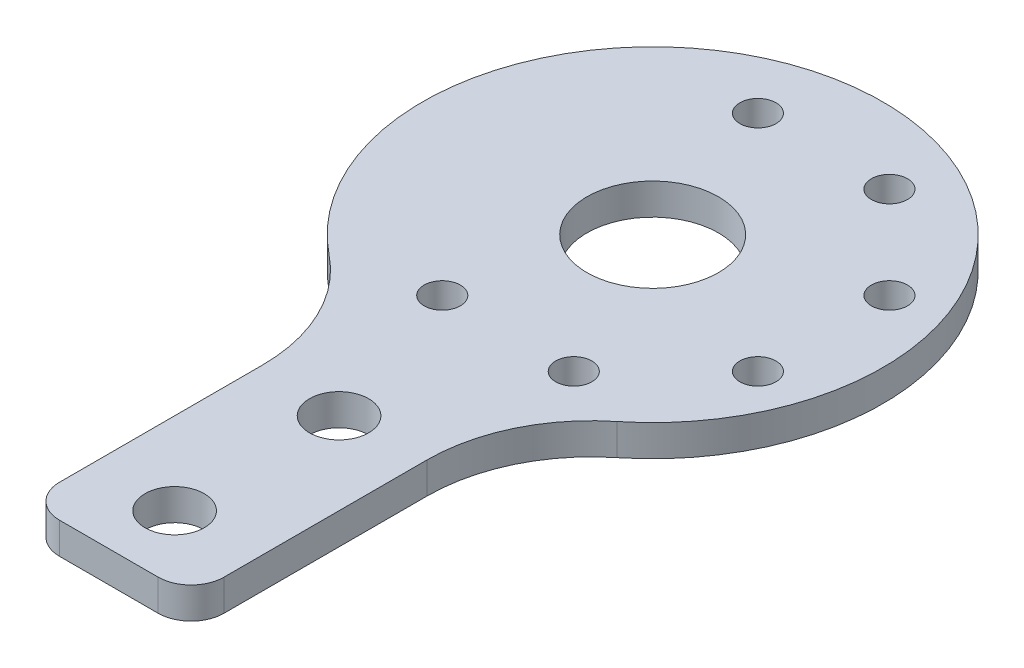
ISO-10303-21;
HEADER;
FILE_DESCRIPTION(('STEP AP214'),'2;1');
FILE_NAME('part.step','',(''),(''),'','','');
FILE_SCHEMA(('AUTOMOTIVE_DESIGN { 1 0 10303 214 1 1 1 1 }'));
ENDSEC;
DATA;
#1=APPLICATION_CONTEXT('core data for automotive mechanical design processes');
#2=APPLICATION_PROTOCOL_DEFINITION('international standard','automotive_design',2000,#1);
#3=PRODUCT_CONTEXT('',#1,'mechanical');
#4=PRODUCT('Part','Part','',(#3));
#5=PRODUCT_RELATED_PRODUCT_CATEGORY('part','',(#4));
#6=PRODUCT_DEFINITION_FORMATION('','',#4);
#7=PRODUCT_DEFINITION_CONTEXT('part definition',#1,'design');
#8=PRODUCT_DEFINITION('design','',#6,#7);
#9=PRODUCT_DEFINITION_SHAPE('','',#8);
#10=(LENGTH_UNIT() NAMED_UNIT(*) SI_UNIT(.MILLI.,.METRE.));
#11=(NAMED_UNIT(*) PLANE_ANGLE_UNIT() SI_UNIT($,.RADIAN.));
#12=(NAMED_UNIT(*) SI_UNIT($,.STERADIAN.) SOLID_ANGLE_UNIT());
#13=UNCERTAINTY_MEASURE_WITH_UNIT(LENGTH_MEASURE(1.E-05),#10,'distance_accuracy_value','');
#14=(GEOMETRIC_REPRESENTATION_CONTEXT(3) GLOBAL_UNCERTAINTY_ASSIGNED_CONTEXT((#13)) GLOBAL_UNIT_ASSIGNED_CONTEXT((#10,
#11,#12)) REPRESENTATION_CONTEXT('',''));
#15=CARTESIAN_POINT('',(0.,0.,0.));
#16=DIRECTION('',(0.,0.,1.));
#17=DIRECTION('',(1.,0.,0.));
#18=AXIS2_PLACEMENT_3D('',#15,#16,#17);
#19=CARTESIAN_POINT('',(12.5,4.7625,82.6917420765551));
#20=DIRECTION('',(-1.,0.,0.));
#21=DIRECTION('',(0.,0.,1.));
#22=AXIS2_PLACEMENT_3D('',#19,#20,#21);
#23=PLANE('',#22);
#24=DIRECTION('',(0.,0.,-1.));
#25=VECTOR('',#24,1.);
#26=CARTESIAN_POINT('',(12.5,4.7625,82.6917420765551));
#27=LINE('',#26,#25);
#28=CARTESIAN_POINT('',(12.5,4.7625,77.691742076555));
#29=VERTEX_POINT('',#28);
#30=CARTESIAN_POINT('',(12.5,4.7625,46.837484987988));
#31=VERTEX_POINT('',#30);
#32=EDGE_CURVE('E223',#29,#31,#27,.T.);
#33=ORIENTED_EDGE('',*,*,#32,.F.);
#34=DIRECTION('',(0.,-1.,0.));
#35=VECTOR('',#34,1.);
#36=CARTESIAN_POINT('',(12.5,4.7625,77.691742076555));
#37=LINE('',#36,#35);
#38=CARTESIAN_POINT('',(12.5,0.,77.691742076555));
#39=VERTEX_POINT('',#38);
#40=EDGE_CURVE('E11',#29,#39,#37,.T.);
#41=ORIENTED_EDGE('',*,*,#40,.T.);
#42=DIRECTION('',(0.,0.,-1.));
#43=VECTOR('',#42,1.);
#44=CARTESIAN_POINT('',(12.5,0.,82.6917420765551));
#45=LINE('',#44,#43);
#46=CARTESIAN_POINT('',(12.5,0.,46.837484987988));
#47=VERTEX_POINT('',#46);
#48=EDGE_CURVE('E232',#39,#47,#45,.T.);
#49=ORIENTED_EDGE('',*,*,#48,.T.);
#50=DIRECTION('',(0.,1.,0.));
#51=VECTOR('',#50,1.);
#52=CARTESIAN_POINT('',(12.5,4.7625,46.837484987988));
#53=LINE('',#52,#51);
#54=EDGE_CURVE('E127',#47,#31,#53,.T.);
#55=ORIENTED_EDGE('',*,*,#54,.T.);
#56=EDGE_LOOP('',(#33,#41,#49,#55));
#57=FACE_BOUND('',#56,.T.);
#58=ADVANCED_FACE('F39',(#57),#23,.F.);
#59=CARTESIAN_POINT('',(0.,4.7625,0.));
#60=DIRECTION('',(0.,-1.,0.));
#61=DIRECTION('',(0.,0.,-1.));
#62=AXIS2_PLACEMENT_3D('',#59,#60,#61);
#63=CYLINDRICAL_SURFACE('',#62,35.);
#64=CARTESIAN_POINT('',(0.,0.,0.));
#65=DIRECTION('',(0.,1.,0.));
#66=DIRECTION('',(0.,0.,1.));
#67=AXIS2_PLACEMENT_3D('',#64,#65,#66);
#68=CIRCLE('',#67,35.);
#69=CARTESIAN_POINT('',(21.875,0.,27.321866242993));
#70=VERTEX_POINT('',#69);
#71=CARTESIAN_POINT('',(-21.875,0.,27.321866242993));
#72=VERTEX_POINT('',#71);
#73=EDGE_CURVE('E116',#70,#72,#68,.T.);
#74=ORIENTED_EDGE('',*,*,#73,.T.);
#75=DIRECTION('',(0.,-1.,0.));
#76=VECTOR('',#75,1.);
#77=CARTESIAN_POINT('',(-21.875,4.7625,27.321866242993));
#78=LINE('',#77,#76);
#79=CARTESIAN_POINT('',(-21.875,4.7625,27.321866242993));
#80=VERTEX_POINT('',#79);
#81=EDGE_CURVE('E124',#72,#80,#78,.F.);
#82=ORIENTED_EDGE('',*,*,#81,.T.);
#83=CARTESIAN_POINT('',(0.,4.7625,0.));
#84=DIRECTION('',(0.,1.,0.));
#85=DIRECTION('',(0.,0.,1.));
#86=AXIS2_PLACEMENT_3D('',#83,#84,#85);
#87=CIRCLE('',#86,35.);
#88=CARTESIAN_POINT('',(21.875,4.7625,27.321866242993));
#89=VERTEX_POINT('',#88);
#90=EDGE_CURVE('E222',#89,#80,#87,.T.);
#91=ORIENTED_EDGE('',*,*,#90,.F.);
#92=DIRECTION('',(0.,-1.,0.));
#93=VECTOR('',#92,1.);
#94=CARTESIAN_POINT('',(21.875,4.7625,27.321866242993));
#95=LINE('',#94,#93);
#96=EDGE_CURVE('E133',#89,#70,#95,.T.);
#97=ORIENTED_EDGE('',*,*,#96,.T.);
#98=EDGE_LOOP('',(#74,#82,#91,#97));
#99=FACE_BOUND('',#98,.T.);
#100=ADVANCED_FACE('F195',(#99),#63,.T.);
#101=CARTESIAN_POINT('',(-12.5,4.7625,82.6917420765551));
#102=DIRECTION('',(-1.,0.,0.));
#103=DIRECTION('',(0.,0.,1.));
#104=AXIS2_PLACEMENT_3D('',#101,#102,#103);
#105=PLANE('',#104);
#106=DIRECTION('',(0.,0.,-1.));
#107=VECTOR('',#106,1.);
#108=CARTESIAN_POINT('',(-12.5,0.,82.6917420765551));
#109=LINE('',#108,#107);
#110=CARTESIAN_POINT('',(-12.5,0.,77.691742076555));
#111=VERTEX_POINT('',#110);
#112=CARTESIAN_POINT('',(-12.5,0.,46.837484987988));
#113=VERTEX_POINT('',#112);
#114=EDGE_CURVE('E105',#111,#113,#109,.T.);
#115=ORIENTED_EDGE('',*,*,#114,.F.);
#116=DIRECTION('',(0.,-1.,0.));
#117=VECTOR('',#116,1.);
#118=CARTESIAN_POINT('',(-12.5,4.7625,77.691742076555));
#119=LINE('',#118,#117);
#120=CARTESIAN_POINT('',(-12.5,4.7625,77.691742076555));
#121=VERTEX_POINT('',#120);
#122=EDGE_CURVE('E63',#111,#121,#119,.F.);
#123=ORIENTED_EDGE('',*,*,#122,.T.);
#124=DIRECTION('',(0.,0.,-1.));
#125=VECTOR('',#124,1.);
#126=CARTESIAN_POINT('',(-12.5,4.7625,82.6917420765551));
#127=LINE('',#126,#125);
#128=CARTESIAN_POINT('',(-12.5,4.7625,46.837484987988));
#129=VERTEX_POINT('',#128);
#130=EDGE_CURVE('E130',#121,#129,#127,.T.);
#131=ORIENTED_EDGE('',*,*,#130,.T.);
#132=DIRECTION('',(0.,-1.,0.));
#133=VECTOR('',#132,1.);
#134=CARTESIAN_POINT('',(-12.5,4.7625,46.837484987988));
#135=LINE('',#134,#133);
#136=EDGE_CURVE('E123',#129,#113,#135,.T.);
#137=ORIENTED_EDGE('',*,*,#136,.T.);
#138=EDGE_LOOP('',(#115,#123,#131,#137));
#139=FACE_BOUND('',#138,.T.);
#140=ADVANCED_FACE('F129',(#139),#105,.T.);
#141=CARTESIAN_POINT('',(-12.5,4.7625,82.6917420765551));
#142=DIRECTION('',(0.,0.,-1.));
#143=DIRECTION('',(-1.,0.,0.));
#144=AXIS2_PLACEMENT_3D('',#141,#142,#143);
#145=PLANE('',#144);
#146=DIRECTION('',(1.,0.,0.));
#147=VECTOR('',#146,1.);
#148=CARTESIAN_POINT('',(-12.5,4.7625,82.6917420765551));
#149=LINE('',#148,#147);
#150=CARTESIAN_POINT('',(-7.5,4.7625,82.6917420765551));
#151=VERTEX_POINT('',#150);
#152=CARTESIAN_POINT('',(7.5,4.7625,82.6917420765551));
#153=VERTEX_POINT('',#152);
#154=EDGE_CURVE('E134',#151,#153,#149,.T.);
#155=ORIENTED_EDGE('',*,*,#154,.F.);
#156=DIRECTION('',(0.,-1.,0.));
#157=VECTOR('',#156,1.);
#158=CARTESIAN_POINT('',(-7.5,0.,82.6917420765551));
#159=LINE('',#158,#157);
#160=CARTESIAN_POINT('',(-7.5,0.,82.6917420765551));
#161=VERTEX_POINT('',#160);
#162=EDGE_CURVE('E160',#151,#161,#159,.T.);
#163=ORIENTED_EDGE('',*,*,#162,.T.);
#164=DIRECTION('',(1.,0.,0.));
#165=VECTOR('',#164,1.);
#166=CARTESIAN_POINT('',(-12.5,0.,82.6917420765551));
#167=LINE('',#166,#165);
#168=CARTESIAN_POINT('',(7.5,0.,82.6917420765551));
#169=VERTEX_POINT('',#168);
#170=EDGE_CURVE('E115',#161,#169,#167,.T.);
#171=ORIENTED_EDGE('',*,*,#170,.T.);
#172=DIRECTION('',(0.,-1.,0.));
#173=VECTOR('',#172,1.);
#174=CARTESIAN_POINT('',(7.5,4.7625,82.6917420765551));
#175=LINE('',#174,#173);
#176=EDGE_CURVE('E157',#169,#153,#175,.F.);
#177=ORIENTED_EDGE('',*,*,#176,.T.);
#178=EDGE_LOOP('',(#155,#163,#171,#177));
#179=FACE_BOUND('',#178,.T.);
#180=ADVANCED_FACE('F179',(#179),#145,.F.);
#181=CARTESIAN_POINT('',(0.,4.7625,0.));
#182=DIRECTION('',(0.,1.,0.));
#183=DIRECTION('',(0.,0.,1.));
#184=AXIS2_PLACEMENT_3D('',#181,#182,#183);
#185=PLANE('',#184);
#186=CARTESIAN_POINT('',(12.,4.7625,-24.));
#187=DIRECTION('',(0.,-1.,0.));
#188=DIRECTION('',(0.,0.,-1.));
#189=AXIS2_PLACEMENT_3D('',#186,#187,#188);
#190=CIRCLE('',#189,2.75);
#191=CARTESIAN_POINT('',(12.,4.7625,-26.75));
#192=VERTEX_POINT('',#191);
#193=EDGE_CURVE('E322',#192,#192,#190,.T.);
#194=ORIENTED_EDGE('',*,*,#193,.T.);
#195=EDGE_LOOP('',(#194));
#196=FACE_BOUND('',#195,.T.);
#197=CARTESIAN_POINT('',(-8.,4.7625,-24.));
#198=DIRECTION('',(0.,-1.,0.));
#199=DIRECTION('',(0.,0.,-1.));
#200=AXIS2_PLACEMENT_3D('',#197,#198,#199);
#201=CIRCLE('',#200,2.75);
#202=CARTESIAN_POINT('',(-8.,4.7625,-26.75));
#203=VERTEX_POINT('',#202);
#204=EDGE_CURVE('E310',#203,#203,#201,.T.);
#205=ORIENTED_EDGE('',*,*,#204,.T.);
#206=EDGE_LOOP('',(#205));
#207=FACE_BOUND('',#206,.T.);
#208=CARTESIAN_POINT('',(26.,4.7625,-10.));
#209=DIRECTION('',(0.,-1.,0.));
#210=DIRECTION('',(0.,0.,-1.));
#211=AXIS2_PLACEMENT_3D('',#208,#209,#210);
#212=CIRCLE('',#211,2.75);
#213=CARTESIAN_POINT('',(26.,4.7625,-12.75));
#214=VERTEX_POINT('',#213);
#215=EDGE_CURVE('E298',#214,#214,#212,.T.);
#216=ORIENTED_EDGE('',*,*,#215,.T.);
#217=EDGE_LOOP('',(#216));
#218=FACE_BOUND('',#217,.T.);
#219=CARTESIAN_POINT('',(26.,4.7625,10.));
#220=DIRECTION('',(0.,-1.,0.));
#221=DIRECTION('',(0.,0.,-1.));
#222=AXIS2_PLACEMENT_3D('',#219,#220,#221);
#223=CIRCLE('',#222,2.75);
#224=CARTESIAN_POINT('',(26.,4.7625,7.25));
#225=VERTEX_POINT('',#224);
#226=EDGE_CURVE('E286',#225,#225,#223,.T.);
#227=ORIENTED_EDGE('',*,*,#226,.T.);
#228=EDGE_LOOP('',(#227));
#229=FACE_BOUND('',#228,.T.);
#230=CARTESIAN_POINT('',(12.,4.7625,24.));
#231=DIRECTION('',(0.,-1.,0.));
#232=DIRECTION('',(0.,0.,-1.));
#233=AXIS2_PLACEMENT_3D('',#230,#231,#232);
#234=CIRCLE('',#233,2.75);
#235=CARTESIAN_POINT('',(12.,4.7625,21.25));
#236=VERTEX_POINT('',#235);
#237=EDGE_CURVE('E274',#236,#236,#234,.T.);
#238=ORIENTED_EDGE('',*,*,#237,.T.);
#239=EDGE_LOOP('',(#238));
#240=FACE_BOUND('',#239,.T.);
#241=CARTESIAN_POINT('',(-8.,4.7625,24.));
#242=DIRECTION('',(0.,-1.,0.));
#243=DIRECTION('',(0.,0.,-1.));
#244=AXIS2_PLACEMENT_3D('',#241,#242,#243);
#245=CIRCLE('',#244,2.75);
#246=CARTESIAN_POINT('',(-8.,4.7625,21.25));
#247=VERTEX_POINT('',#246);
#248=EDGE_CURVE('E262',#247,#247,#245,.T.);
#249=ORIENTED_EDGE('',*,*,#248,.T.);
#250=EDGE_LOOP('',(#249));
#251=FACE_BOUND('',#250,.T.);
#252=CARTESIAN_POINT('',(0.,4.7625,47.6917420765551));
#253=DIRECTION('',(0.,-1.,0.));
#254=DIRECTION('',(0.,0.,-1.));
#255=AXIS2_PLACEMENT_3D('',#252,#253,#254);
#256=CIRCLE('',#255,4.49999999999999);
#257=CARTESIAN_POINT('',(0.,4.7625,43.1917420765551));
#258=VERTEX_POINT('',#257);
#259=EDGE_CURVE('E254',#258,#258,#256,.T.);
#260=ORIENTED_EDGE('',*,*,#259,.T.);
#261=EDGE_LOOP('',(#260));
#262=FACE_BOUND('',#261,.T.);
#263=CARTESIAN_POINT('',(0.,4.7625,72.6917420765551));
#264=DIRECTION('',(0.,-1.,0.));
#265=DIRECTION('',(0.,0.,-1.));
#266=AXIS2_PLACEMENT_3D('',#263,#264,#265);
#267=CIRCLE('',#266,4.49999999999999);
#268=CARTESIAN_POINT('',(0.,4.7625,68.1917420765551));
#269=VERTEX_POINT('',#268);
#270=EDGE_CURVE('E247',#269,#269,#267,.T.);
#271=ORIENTED_EDGE('',*,*,#270,.T.);
#272=EDGE_LOOP('',(#271));
#273=FACE_BOUND('',#272,.T.);
#274=CARTESIAN_POINT('',(0.,4.7625,0.));
#275=DIRECTION('',(0.,-1.,0.));
#276=DIRECTION('',(0.,0.,-1.));
#277=AXIS2_PLACEMENT_3D('',#274,#275,#276);
#278=CIRCLE('',#277,10.);
#279=CARTESIAN_POINT('',(0.,4.7625,-10.));
#280=VERTEX_POINT('',#279);
#281=EDGE_CURVE('E235',#280,#280,#278,.T.);
#282=ORIENTED_EDGE('',*,*,#281,.T.);
#283=EDGE_LOOP('',(#282));
#284=FACE_BOUND('',#283,.T.);
#285=ORIENTED_EDGE('',*,*,#130,.F.);
#286=CARTESIAN_POINT('',(-7.5,4.7625,77.691742076555));
#287=DIRECTION('',(0.,1.,0.));
#288=DIRECTION('',(0.,0.,1.));
#289=AXIS2_PLACEMENT_3D('',#286,#287,#288);
#290=CIRCLE('',#289,5.);
#291=EDGE_CURVE('E48',#121,#151,#290,.T.);
#292=ORIENTED_EDGE('',*,*,#291,.T.);
#293=ORIENTED_EDGE('',*,*,#154,.T.);
#294=CARTESIAN_POINT('',(7.5,4.7625,77.691742076555));
#295=DIRECTION('',(0.,1.,0.));
#296=DIRECTION('',(0.,0.,1.));
#297=AXIS2_PLACEMENT_3D('',#294,#295,#296);
#298=CIRCLE('',#297,5.);
#299=EDGE_CURVE('E55',#153,#29,#298,.T.);
#300=ORIENTED_EDGE('',*,*,#299,.T.);
#301=ORIENTED_EDGE('',*,*,#32,.T.);
#302=CARTESIAN_POINT('',(37.5,4.7625,46.837484987988));
#303=DIRECTION('',(0.,1.,0.));
#304=DIRECTION('',(0.,0.,1.));
#305=AXIS2_PLACEMENT_3D('',#302,#303,#304);
#306=CIRCLE('',#305,25.);
#307=EDGE_CURVE('E154',#31,#89,#306,.F.);
#308=ORIENTED_EDGE('',*,*,#307,.T.);
#309=ORIENTED_EDGE('',*,*,#90,.T.);
#310=CARTESIAN_POINT('',(-37.5,4.7625,46.837484987988));
#311=DIRECTION('',(0.,1.,0.));
#312=DIRECTION('',(0.,0.,1.));
#313=AXIS2_PLACEMENT_3D('',#310,#311,#312);
#314=CIRCLE('',#313,25.);
#315=EDGE_CURVE('E126',#80,#129,#314,.F.);
#316=ORIENTED_EDGE('',*,*,#315,.T.);
#317=EDGE_LOOP('',(#285,#292,#293,#300,#301,#308,#309,#316));
#318=FACE_BOUND('',#317,.T.);
#319=ADVANCED_FACE('F175',(#196,#207,#218,#229,#240,#251,#262,#273,#284,#318),#185,.T.);
#320=CARTESIAN_POINT('',(0.,0.,0.));
#321=DIRECTION('',(0.,1.,0.));
#322=DIRECTION('',(0.,0.,1.));
#323=AXIS2_PLACEMENT_3D('',#320,#321,#322);
#324=PLANE('',#323);
#325=CARTESIAN_POINT('',(12.,0.,-24.));
#326=DIRECTION('',(0.,-1.,0.));
#327=DIRECTION('',(0.,0.,-1.));
#328=AXIS2_PLACEMENT_3D('',#325,#326,#327);
#329=CIRCLE('',#328,2.775);
#330=CARTESIAN_POINT('',(12.,0.,-26.775));
#331=VERTEX_POINT('',#330);
#332=EDGE_CURVE('E330',#331,#331,#329,.T.);
#333=ORIENTED_EDGE('',*,*,#332,.F.);
#334=EDGE_LOOP('',(#333));
#335=FACE_BOUND('',#334,.T.);
#336=CARTESIAN_POINT('',(-8.,0.,-24.));
#337=DIRECTION('',(0.,-1.,0.));
#338=DIRECTION('',(0.,0.,-1.));
#339=AXIS2_PLACEMENT_3D('',#336,#337,#338);
#340=CIRCLE('',#339,2.775);
#341=CARTESIAN_POINT('',(-8.,0.,-26.775));
#342=VERTEX_POINT('',#341);
#343=EDGE_CURVE('E318',#342,#342,#340,.T.);
#344=ORIENTED_EDGE('',*,*,#343,.F.);
#345=EDGE_LOOP('',(#344));
#346=FACE_BOUND('',#345,.T.);
#347=CARTESIAN_POINT('',(26.,0.,-10.));
#348=DIRECTION('',(0.,-1.,0.));
#349=DIRECTION('',(0.,0.,-1.));
#350=AXIS2_PLACEMENT_3D('',#347,#348,#349);
#351=CIRCLE('',#350,2.775);
#352=CARTESIAN_POINT('',(26.,0.,-12.775));
#353=VERTEX_POINT('',#352);
#354=EDGE_CURVE('E306',#353,#353,#351,.T.);
#355=ORIENTED_EDGE('',*,*,#354,.F.);
#356=EDGE_LOOP('',(#355));
#357=FACE_BOUND('',#356,.T.);
#358=CARTESIAN_POINT('',(26.,0.,10.));
#359=DIRECTION('',(0.,-1.,0.));
#360=DIRECTION('',(0.,0.,-1.));
#361=AXIS2_PLACEMENT_3D('',#358,#359,#360);
#362=CIRCLE('',#361,2.775);
#363=CARTESIAN_POINT('',(26.,0.,7.225));
#364=VERTEX_POINT('',#363);
#365=EDGE_CURVE('E294',#364,#364,#362,.T.);
#366=ORIENTED_EDGE('',*,*,#365,.F.);
#367=EDGE_LOOP('',(#366));
#368=FACE_BOUND('',#367,.T.);
#369=CARTESIAN_POINT('',(12.,0.,24.));
#370=DIRECTION('',(0.,-1.,0.));
#371=DIRECTION('',(0.,0.,-1.));
#372=AXIS2_PLACEMENT_3D('',#369,#370,#371);
#373=CIRCLE('',#372,2.775);
#374=CARTESIAN_POINT('',(12.,0.,21.225));
#375=VERTEX_POINT('',#374);
#376=EDGE_CURVE('E282',#375,#375,#373,.T.);
#377=ORIENTED_EDGE('',*,*,#376,.F.);
#378=EDGE_LOOP('',(#377));
#379=FACE_BOUND('',#378,.T.);
#380=CARTESIAN_POINT('',(-8.,0.,24.));
#381=DIRECTION('',(0.,-1.,0.));
#382=DIRECTION('',(0.,0.,-1.));
#383=AXIS2_PLACEMENT_3D('',#380,#381,#382);
#384=CIRCLE('',#383,2.775);
#385=CARTESIAN_POINT('',(-8.,0.,21.225));
#386=VERTEX_POINT('',#385);
#387=EDGE_CURVE('E270',#386,#386,#384,.T.);
#388=ORIENTED_EDGE('',*,*,#387,.F.);
#389=EDGE_LOOP('',(#388));
#390=FACE_BOUND('',#389,.T.);
#391=CARTESIAN_POINT('',(0.,0.,47.6917420765551));
#392=DIRECTION('',(0.,-1.,0.));
#393=DIRECTION('',(0.,0.,-1.));
#394=AXIS2_PLACEMENT_3D('',#391,#392,#393);
#395=CIRCLE('',#394,4.5);
#396=CARTESIAN_POINT('',(0.,0.,43.1917420765551));
#397=VERTEX_POINT('',#396);
#398=EDGE_CURVE('E258',#397,#397,#395,.T.);
#399=ORIENTED_EDGE('',*,*,#398,.F.);
#400=EDGE_LOOP('',(#399));
#401=FACE_BOUND('',#400,.T.);
#402=CARTESIAN_POINT('',(0.,0.,72.6917420765551));
#403=DIRECTION('',(0.,-1.,0.));
#404=DIRECTION('',(0.,0.,-1.));
#405=AXIS2_PLACEMENT_3D('',#402,#403,#404);
#406=CIRCLE('',#405,4.5);
#407=CARTESIAN_POINT('',(0.,0.,68.1917420765551));
#408=VERTEX_POINT('',#407);
#409=EDGE_CURVE('E250',#408,#408,#406,.T.);
#410=ORIENTED_EDGE('',*,*,#409,.F.);
#411=EDGE_LOOP('',(#410));
#412=FACE_BOUND('',#411,.T.);
#413=CARTESIAN_POINT('',(0.,0.,0.));
#414=DIRECTION('',(0.,-1.,0.));
#415=DIRECTION('',(0.,0.,-1.));
#416=AXIS2_PLACEMENT_3D('',#413,#414,#415);
#417=CIRCLE('',#416,10.);
#418=CARTESIAN_POINT('',(0.,0.,-10.));
#419=VERTEX_POINT('',#418);
#420=EDGE_CURVE('E243',#419,#419,#417,.T.);
#421=ORIENTED_EDGE('',*,*,#420,.F.);
#422=EDGE_LOOP('',(#421));
#423=FACE_BOUND('',#422,.T.);
#424=ORIENTED_EDGE('',*,*,#170,.F.);
#425=CARTESIAN_POINT('',(-7.5,0.,77.691742076555));
#426=DIRECTION('',(0.,1.,0.));
#427=DIRECTION('',(0.,0.,1.));
#428=AXIS2_PLACEMENT_3D('',#425,#426,#427);
#429=CIRCLE('',#428,5.);
#430=EDGE_CURVE('E112',#161,#111,#429,.F.);
#431=ORIENTED_EDGE('',*,*,#430,.T.);
#432=ORIENTED_EDGE('',*,*,#114,.T.);
#433=CARTESIAN_POINT('',(-37.5,0.,46.837484987988));
#434=DIRECTION('',(0.,1.,0.));
#435=DIRECTION('',(0.,0.,1.));
#436=AXIS2_PLACEMENT_3D('',#433,#434,#435);
#437=CIRCLE('',#436,25.);
#438=EDGE_CURVE('E110',#113,#72,#437,.T.);
#439=ORIENTED_EDGE('',*,*,#438,.T.);
#440=ORIENTED_EDGE('',*,*,#73,.F.);
#441=CARTESIAN_POINT('',(37.5,0.,46.837484987988));
#442=DIRECTION('',(0.,1.,0.));
#443=DIRECTION('',(0.,0.,1.));
#444=AXIS2_PLACEMENT_3D('',#441,#442,#443);
#445=CIRCLE('',#444,25.);
#446=EDGE_CURVE('E150',#70,#47,#445,.T.);
#447=ORIENTED_EDGE('',*,*,#446,.T.);
#448=ORIENTED_EDGE('',*,*,#48,.F.);
#449=CARTESIAN_POINT('',(7.5,0.,77.691742076555));
#450=DIRECTION('',(0.,1.,0.));
#451=DIRECTION('',(0.,0.,1.));
#452=AXIS2_PLACEMENT_3D('',#449,#450,#451);
#453=CIRCLE('',#452,5.);
#454=EDGE_CURVE('E164',#39,#169,#453,.F.);
#455=ORIENTED_EDGE('',*,*,#454,.T.);
#456=EDGE_LOOP('',(#424,#431,#432,#439,#440,#447,#448,#455));
#457=FACE_BOUND('',#456,.T.);
#458=ADVANCED_FACE('F108',(#335,#346,#357,#368,#379,#390,#401,#412,#423,#457),#324,.F.);
#459=CARTESIAN_POINT('',(0.,4.7625,0.));
#460=DIRECTION('',(0.,-1.,0.));
#461=DIRECTION('',(0.,0.,-1.));
#462=AXIS2_PLACEMENT_3D('',#459,#460,#461);
#463=CYLINDRICAL_SURFACE('',#462,10.);
#464=CARTESIAN_POINT('',(0.,4.7625,-10.));
#465=CARTESIAN_POINT('',(0.,4.712890625,-10.));
#466=CARTESIAN_POINT('',(0.,4.66328125,-10.));
#467=CARTESIAN_POINT('',(0.,4.5640625,-10.));
#468=CARTESIAN_POINT('',(0.,4.514453125,-10.));
#469=CARTESIAN_POINT('',(0.,4.415234375,-10.));
#470=CARTESIAN_POINT('',(0.,4.365625,-10.));
#471=CARTESIAN_POINT('',(0.,4.26640625,-10.));
#472=CARTESIAN_POINT('',(0.,4.216796875,-10.));
#473=CARTESIAN_POINT('',(0.,4.117578125,-10.));
#474=CARTESIAN_POINT('',(0.,4.06796875,-10.));
#475=CARTESIAN_POINT('',(0.,3.96875,-10.));
#476=CARTESIAN_POINT('',(0.,3.919140625,-10.));
#477=CARTESIAN_POINT('',(0.,3.819921875,-10.));
#478=CARTESIAN_POINT('',(0.,3.7703125,-10.));
#479=CARTESIAN_POINT('',(0.,3.67109375,-10.));
#480=CARTESIAN_POINT('',(0.,3.621484375,-10.));
#481=CARTESIAN_POINT('',(0.,3.522265625,-10.));
#482=CARTESIAN_POINT('',(0.,3.47265625,-10.));
#483=CARTESIAN_POINT('',(0.,3.3734375,-10.));
#484=CARTESIAN_POINT('',(0.,3.323828125,-10.));
#485=CARTESIAN_POINT('',(0.,3.224609375,-10.));
#486=CARTESIAN_POINT('',(0.,3.175,-10.));
#487=CARTESIAN_POINT('',(0.,3.07578125,-10.));
#488=CARTESIAN_POINT('',(0.,3.026171875,-10.));
#489=CARTESIAN_POINT('',(0.,2.926953125,-10.));
#490=CARTESIAN_POINT('',(0.,2.87734375,-10.));
#491=CARTESIAN_POINT('',(0.,2.778125,-10.));
#492=CARTESIAN_POINT('',(0.,2.728515625,-10.));
#493=CARTESIAN_POINT('',(0.,2.629296875,-10.));
#494=CARTESIAN_POINT('',(0.,2.5796875,-10.));
#495=CARTESIAN_POINT('',(0.,2.48046875,-10.));
#496=CARTESIAN_POINT('',(0.,2.430859375,-10.));
#497=CARTESIAN_POINT('',(0.,2.331640625,-10.));
#498=CARTESIAN_POINT('',(0.,2.28203125,-10.));
#499=CARTESIAN_POINT('',(0.,2.1828125,-10.));
#500=CARTESIAN_POINT('',(0.,2.133203125,-10.));
#501=CARTESIAN_POINT('',(0.,2.033984375,-10.));
#502=CARTESIAN_POINT('',(0.,1.984375,-10.));
#503=CARTESIAN_POINT('',(0.,1.88515625,-10.));
#504=CARTESIAN_POINT('',(0.,1.835546875,-10.));
#505=CARTESIAN_POINT('',(0.,1.736328125,-10.));
#506=CARTESIAN_POINT('',(0.,1.68671875,-10.));
#507=CARTESIAN_POINT('',(0.,1.5875,-10.));
#508=CARTESIAN_POINT('',(0.,1.537890625,-10.));
#509=CARTESIAN_POINT('',(0.,1.438671875,-10.));
#510=CARTESIAN_POINT('',(0.,1.3890625,-10.));
#511=CARTESIAN_POINT('',(0.,1.28984375,-10.));
#512=CARTESIAN_POINT('',(0.,1.240234375,-10.));
#513=CARTESIAN_POINT('',(0.,1.141015625,-10.));
#514=CARTESIAN_POINT('',(0.,1.09140625,-10.));
#515=CARTESIAN_POINT('',(0.,0.9921875,-10.));
#516=CARTESIAN_POINT('',(0.,0.942578125,-10.));
#517=CARTESIAN_POINT('',(0.,0.843359375,-10.));
#518=CARTESIAN_POINT('',(0.,0.79375,-10.));
#519=CARTESIAN_POINT('',(0.,0.69453125,-10.));
#520=CARTESIAN_POINT('',(0.,0.644921875,-10.));
#521=CARTESIAN_POINT('',(0.,0.545703125,-10.));
#522=CARTESIAN_POINT('',(0.,0.49609375,-10.));
#523=CARTESIAN_POINT('',(0.,0.396875,-10.));
#524=CARTESIAN_POINT('',(0.,0.347265625,-10.));
#525=CARTESIAN_POINT('',(0.,0.248046875,-10.));
#526=CARTESIAN_POINT('',(0.,0.1984375,-10.));
#527=CARTESIAN_POINT('',(0.,0.09921875,-10.));
#528=CARTESIAN_POINT('',(0.,0.049609375,-10.));
#529=CARTESIAN_POINT('',(0.,0.,-10.));
#530=B_SPLINE_CURVE_WITH_KNOTS('',3,(#464,#465,#466,#467,#468,#469,#470,#471,#472,#473,#474,
#475,#476,#477,#478,#479,#480,#481,#482,#483,#484,#485,#486,#487,#488,#489,#490,#491,#492,#493,
#494,#495,#496,#497,#498,#499,#500,#501,#502,#503,#504,#505,#506,#507,#508,#509,#510,#511,#512,
#513,#514,#515,#516,#517,#518,#519,#520,#521,#522,#523,#524,#525,#526,#527,#528,#529),
.UNSPECIFIED.,.F.,.F.,(4,2,2,2,2,2,2,2,2,2,2,2,2,2,2,2,2,2,2,2,2,2,2,2,2,2,2,2,2,2,2,2,4),(0.,
0.148828124999999,0.297656249999999,0.446484374999999,0.595312499999999,0.744140625,0.89296875,
1.041796875,1.190625,1.339453125,1.48828125,1.637109375,1.7859375,1.934765625,2.08359375,
2.232421875,2.38125,2.530078125,2.67890625,2.827734375,2.9765625,3.125390625,3.27421875,
3.423046875,3.571875,3.720703125,3.86953125,4.018359375,4.1671875,4.316015625,4.46484375,
4.613671875,4.7625),.UNSPECIFIED.);
#531=EDGE_CURVE('BSEAM339',#280,#419,#530,.T.);
#532=ORIENTED_EDGE('',*,*,#281,.F.);
#533=ORIENTED_EDGE('',*,*,#420,.T.);
#534=ORIENTED_EDGE('',*,*,#531,.T.);
#535=ORIENTED_EDGE('',*,*,#531,.F.);
#536=EDGE_LOOP('',(#532,#534,#533,#535));
#537=FACE_BOUND('',#536,.T.);
#538=ADVANCED_FACE('F339',(#537),#463,.F.);
#539=CARTESIAN_POINT('',(0.,0.,72.6917420765551));
#540=DIRECTION('',(0.,-1.,0.));
#541=DIRECTION('',(0.,0.,-1.));
#542=AXIS2_PLACEMENT_3D('',#539,#540,#541);
#543=CYLINDRICAL_SURFACE('',#542,4.5);
#544=ORIENTED_EDGE('',*,*,#270,.F.);
#545=EDGE_LOOP('',(#544));
#546=FACE_BOUND('',#545,.T.);
#547=ORIENTED_EDGE('',*,*,#409,.T.);
#548=EDGE_LOOP('',(#547));
#549=FACE_BOUND('',#548,.T.);
#550=ADVANCED_FACE('F358',(#546,#549),#543,.F.);
#551=CARTESIAN_POINT('',(0.,0.,47.6917420765551));
#552=DIRECTION('',(0.,-1.,0.));
#553=DIRECTION('',(0.,0.,-1.));
#554=AXIS2_PLACEMENT_3D('',#551,#552,#553);
#555=CYLINDRICAL_SURFACE('',#554,4.5);
#556=ORIENTED_EDGE('',*,*,#259,.F.);
#557=EDGE_LOOP('',(#556));
#558=FACE_BOUND('',#557,.T.);
#559=ORIENTED_EDGE('',*,*,#398,.T.);
#560=EDGE_LOOP('',(#559));
#561=FACE_BOUND('',#560,.T.);
#562=ADVANCED_FACE('F207',(#558,#561),#555,.F.);
#563=CARTESIAN_POINT('',(-37.5,4.7625,46.837484987988));
#564=DIRECTION('',(0.,-1.,0.));
#565=DIRECTION('',(0.,0.,-1.));
#566=AXIS2_PLACEMENT_3D('',#563,#564,#565);
#567=CYLINDRICAL_SURFACE('',#566,25.);
#568=ORIENTED_EDGE('',*,*,#315,.F.);
#569=ORIENTED_EDGE('',*,*,#81,.F.);
#570=ORIENTED_EDGE('',*,*,#438,.F.);
#571=ORIENTED_EDGE('',*,*,#136,.F.);
#572=EDGE_LOOP('',(#568,#569,#570,#571));
#573=FACE_BOUND('',#572,.T.);
#574=ADVANCED_FACE('F122',(#573),#567,.F.);
#575=CARTESIAN_POINT('',(37.5,4.7625,46.837484987988));
#576=DIRECTION('',(0.,-1.,0.));
#577=DIRECTION('',(0.,0.,-1.));
#578=AXIS2_PLACEMENT_3D('',#575,#576,#577);
#579=CYLINDRICAL_SURFACE('',#578,25.);
#580=ORIENTED_EDGE('',*,*,#307,.F.);
#581=ORIENTED_EDGE('',*,*,#54,.F.);
#582=ORIENTED_EDGE('',*,*,#446,.F.);
#583=ORIENTED_EDGE('',*,*,#96,.F.);
#584=EDGE_LOOP('',(#580,#581,#582,#583));
#585=FACE_BOUND('',#584,.T.);
#586=ADVANCED_FACE('F206',(#585),#579,.F.);
#587=CARTESIAN_POINT('',(-8.,0.,24.));
#588=DIRECTION('',(0.,-1.,0.));
#589=DIRECTION('',(0.,0.,-1.));
#590=AXIS2_PLACEMENT_3D('',#587,#588,#589);
#591=CYLINDRICAL_SURFACE('',#590,2.75);
#592=ORIENTED_EDGE('',*,*,#248,.F.);
#593=EDGE_LOOP('',(#592));
#594=FACE_BOUND('',#593,.T.);
#595=CARTESIAN_POINT('',(-8.,0.0250000000000011,24.));
#596=DIRECTION('',(0.,-1.,0.));
#597=DIRECTION('',(0.,0.,-1.));
#598=AXIS2_PLACEMENT_3D('',#595,#596,#597);
#599=CIRCLE('',#598,2.75);
#600=CARTESIAN_POINT('',(-8.,0.0250000000000011,21.25));
#601=VERTEX_POINT('',#600);
#602=EDGE_CURVE('E266',#601,#601,#599,.T.);
#603=ORIENTED_EDGE('',*,*,#602,.T.);
#604=EDGE_LOOP('',(#603));
#605=FACE_BOUND('',#604,.T.);
#606=ADVANCED_FACE('F209',(#594,#605),#591,.F.);
#607=CARTESIAN_POINT('',(-8.,0.,24.));
#608=DIRECTION('',(0.,-1.,0.));
#609=DIRECTION('',(0.,0.,-1.));
#610=AXIS2_PLACEMENT_3D('',#607,#608,#609);
#611=CONICAL_SURFACE('',#610,2.775,0.785398163397422);
#612=ORIENTED_EDGE('',*,*,#602,.F.);
#613=EDGE_LOOP('',(#612));
#614=FACE_BOUND('',#613,.T.);
#615=ORIENTED_EDGE('',*,*,#387,.T.);
#616=EDGE_LOOP('',(#615));
#617=FACE_BOUND('',#616,.T.);
#618=ADVANCED_FACE('F214',(#614,#617),#611,.F.);
#619=CARTESIAN_POINT('',(12.,0.,24.));
#620=DIRECTION('',(0.,-1.,0.));
#621=DIRECTION('',(0.,0.,-1.));
#622=AXIS2_PLACEMENT_3D('',#619,#620,#621);
#623=CYLINDRICAL_SURFACE('',#622,2.75);
#624=ORIENTED_EDGE('',*,*,#237,.F.);
#625=EDGE_LOOP('',(#624));
#626=FACE_BOUND('',#625,.T.);
#627=CARTESIAN_POINT('',(12.,0.0250000000000011,24.));
#628=DIRECTION('',(0.,-1.,0.));
#629=DIRECTION('',(0.,0.,-1.));
#630=AXIS2_PLACEMENT_3D('',#627,#628,#629);
#631=CIRCLE('',#630,2.75);
#632=CARTESIAN_POINT('',(12.,0.0250000000000011,21.25));
#633=VERTEX_POINT('',#632);
#634=EDGE_CURVE('E278',#633,#633,#631,.T.);
#635=ORIENTED_EDGE('',*,*,#634,.T.);
#636=EDGE_LOOP('',(#635));
#637=FACE_BOUND('',#636,.T.);
#638=ADVANCED_FACE('F479',(#626,#637),#623,.F.);
#639=CARTESIAN_POINT('',(12.,0.,24.));
#640=DIRECTION('',(0.,-1.,0.));
#641=DIRECTION('',(0.,0.,-1.));
#642=AXIS2_PLACEMENT_3D('',#639,#640,#641);
#643=CONICAL_SURFACE('',#642,2.775,0.785398163397405);
#644=ORIENTED_EDGE('',*,*,#634,.F.);
#645=EDGE_LOOP('',(#644));
#646=FACE_BOUND('',#645,.T.);
#647=ORIENTED_EDGE('',*,*,#376,.T.);
#648=EDGE_LOOP('',(#647));
#649=FACE_BOUND('',#648,.T.);
#650=ADVANCED_FACE('F470',(#646,#649),#643,.F.);
#651=CARTESIAN_POINT('',(26.,0.,10.));
#652=DIRECTION('',(0.,-1.,0.));
#653=DIRECTION('',(0.,0.,-1.));
#654=AXIS2_PLACEMENT_3D('',#651,#652,#653);
#655=CYLINDRICAL_SURFACE('',#654,2.75);
#656=ORIENTED_EDGE('',*,*,#226,.F.);
#657=EDGE_LOOP('',(#656));
#658=FACE_BOUND('',#657,.T.);
#659=CARTESIAN_POINT('',(26.,0.0250000000000011,10.));
#660=DIRECTION('',(0.,-1.,0.));
#661=DIRECTION('',(0.,0.,-1.));
#662=AXIS2_PLACEMENT_3D('',#659,#660,#661);
#663=CIRCLE('',#662,2.75);
#664=CARTESIAN_POINT('',(26.,0.0250000000000011,7.25));
#665=VERTEX_POINT('',#664);
#666=EDGE_CURVE('E290',#665,#665,#663,.T.);
#667=ORIENTED_EDGE('',*,*,#666,.T.);
#668=EDGE_LOOP('',(#667));
#669=FACE_BOUND('',#668,.T.);
#670=ADVANCED_FACE('F461',(#658,#669),#655,.F.);
#671=CARTESIAN_POINT('',(26.,0.,10.));
#672=DIRECTION('',(0.,-1.,0.));
#673=DIRECTION('',(0.,0.,-1.));
#674=AXIS2_PLACEMENT_3D('',#671,#672,#673);
#675=CONICAL_SURFACE('',#674,2.775,0.78539816339744);
#676=ORIENTED_EDGE('',*,*,#666,.F.);
#677=EDGE_LOOP('',(#676));
#678=FACE_BOUND('',#677,.T.);
#679=ORIENTED_EDGE('',*,*,#365,.T.);
#680=EDGE_LOOP('',(#679));
#681=FACE_BOUND('',#680,.T.);
#682=ADVANCED_FACE('F452',(#678,#681),#675,.F.);
#683=CARTESIAN_POINT('',(26.,0.,-10.));
#684=DIRECTION('',(0.,-1.,0.));
#685=DIRECTION('',(0.,0.,-1.));
#686=AXIS2_PLACEMENT_3D('',#683,#684,#685);
#687=CYLINDRICAL_SURFACE('',#686,2.75);
#688=ORIENTED_EDGE('',*,*,#215,.F.);
#689=EDGE_LOOP('',(#688));
#690=FACE_BOUND('',#689,.T.);
#691=CARTESIAN_POINT('',(26.,0.0250000000000011,-10.));
#692=DIRECTION('',(0.,-1.,0.));
#693=DIRECTION('',(0.,0.,-1.));
#694=AXIS2_PLACEMENT_3D('',#691,#692,#693);
#695=CIRCLE('',#694,2.75);
#696=CARTESIAN_POINT('',(26.,0.0250000000000011,-12.75));
#697=VERTEX_POINT('',#696);
#698=EDGE_CURVE('E302',#697,#697,#695,.T.);
#699=ORIENTED_EDGE('',*,*,#698,.T.);
#700=EDGE_LOOP('',(#699));
#701=FACE_BOUND('',#700,.T.);
#702=ADVANCED_FACE('F443',(#690,#701),#687,.F.);
#703=CARTESIAN_POINT('',(26.,0.,-10.));
#704=DIRECTION('',(0.,-1.,0.));
#705=DIRECTION('',(0.,0.,-1.));
#706=AXIS2_PLACEMENT_3D('',#703,#704,#705);
#707=CONICAL_SURFACE('',#706,2.775,0.78539816339744);
#708=ORIENTED_EDGE('',*,*,#698,.F.);
#709=EDGE_LOOP('',(#708));
#710=FACE_BOUND('',#709,.T.);
#711=ORIENTED_EDGE('',*,*,#354,.T.);
#712=EDGE_LOOP('',(#711));
#713=FACE_BOUND('',#712,.T.);
#714=ADVANCED_FACE('F434',(#710,#713),#707,.F.);
#715=CARTESIAN_POINT('',(-8.,0.,-24.));
#716=DIRECTION('',(0.,-1.,0.));
#717=DIRECTION('',(0.,0.,-1.));
#718=AXIS2_PLACEMENT_3D('',#715,#716,#717);
#719=CYLINDRICAL_SURFACE('',#718,2.75);
#720=ORIENTED_EDGE('',*,*,#204,.F.);
#721=EDGE_LOOP('',(#720));
#722=FACE_BOUND('',#721,.T.);
#723=CARTESIAN_POINT('',(-8.,0.0250000000000011,-24.));
#724=DIRECTION('',(0.,-1.,0.));
#725=DIRECTION('',(0.,0.,-1.));
#726=AXIS2_PLACEMENT_3D('',#723,#724,#725);
#727=CIRCLE('',#726,2.75);
#728=CARTESIAN_POINT('',(-8.,0.0250000000000011,-26.75));
#729=VERTEX_POINT('',#728);
#730=EDGE_CURVE('E314',#729,#729,#727,.T.);
#731=ORIENTED_EDGE('',*,*,#730,.T.);
#732=EDGE_LOOP('',(#731));
#733=FACE_BOUND('',#732,.T.);
#734=ADVANCED_FACE('F425',(#722,#733),#719,.F.);
#735=CARTESIAN_POINT('',(-8.,0.,-24.));
#736=DIRECTION('',(0.,-1.,0.));
#737=DIRECTION('',(0.,0.,-1.));
#738=AXIS2_PLACEMENT_3D('',#735,#736,#737);
#739=CONICAL_SURFACE('',#738,2.775,0.785398163397422);
#740=ORIENTED_EDGE('',*,*,#730,.F.);
#741=EDGE_LOOP('',(#740));
#742=FACE_BOUND('',#741,.T.);
#743=ORIENTED_EDGE('',*,*,#343,.T.);
#744=EDGE_LOOP('',(#743));
#745=FACE_BOUND('',#744,.T.);
#746=ADVANCED_FACE('F416',(#742,#745),#739,.F.);
#747=CARTESIAN_POINT('',(12.,0.,-24.));
#748=DIRECTION('',(0.,-1.,0.));
#749=DIRECTION('',(0.,0.,-1.));
#750=AXIS2_PLACEMENT_3D('',#747,#748,#749);
#751=CYLINDRICAL_SURFACE('',#750,2.75);
#752=ORIENTED_EDGE('',*,*,#193,.F.);
#753=EDGE_LOOP('',(#752));
#754=FACE_BOUND('',#753,.T.);
#755=CARTESIAN_POINT('',(12.,0.0250000000000011,-24.));
#756=DIRECTION('',(0.,-1.,0.));
#757=DIRECTION('',(0.,0.,-1.));
#758=AXIS2_PLACEMENT_3D('',#755,#756,#757);
#759=CIRCLE('',#758,2.75);
#760=CARTESIAN_POINT('',(12.,0.0250000000000011,-26.75));
#761=VERTEX_POINT('',#760);
#762=EDGE_CURVE('E326',#761,#761,#759,.T.);
#763=ORIENTED_EDGE('',*,*,#762,.T.);
#764=EDGE_LOOP('',(#763));
#765=FACE_BOUND('',#764,.T.);
#766=ADVANCED_FACE('F190',(#754,#765),#751,.F.);
#767=CARTESIAN_POINT('',(12.,0.,-24.));
#768=DIRECTION('',(0.,-1.,0.));
#769=DIRECTION('',(0.,0.,-1.));
#770=AXIS2_PLACEMENT_3D('',#767,#768,#769);
#771=CONICAL_SURFACE('',#770,2.775,0.785398163397405);
#772=ORIENTED_EDGE('',*,*,#762,.F.);
#773=EDGE_LOOP('',(#772));
#774=FACE_BOUND('',#773,.T.);
#775=ORIENTED_EDGE('',*,*,#332,.T.);
#776=EDGE_LOOP('',(#775));
#777=FACE_BOUND('',#776,.T.);
#778=ADVANCED_FACE('F184',(#774,#777),#771,.F.);
#779=CARTESIAN_POINT('',(-7.5,4.7625,77.691742076555));
#780=DIRECTION('',(0.,1.,0.));
#781=DIRECTION('',(0.,0.,1.));
#782=AXIS2_PLACEMENT_3D('',#779,#780,#781);
#783=CYLINDRICAL_SURFACE('',#782,5.);
#784=ORIENTED_EDGE('',*,*,#291,.F.);
#785=ORIENTED_EDGE('',*,*,#122,.F.);
#786=ORIENTED_EDGE('',*,*,#430,.F.);
#787=ORIENTED_EDGE('',*,*,#162,.F.);
#788=EDGE_LOOP('',(#784,#785,#786,#787));
#789=FACE_BOUND('',#788,.T.);
#790=ADVANCED_FACE('F182',(#789),#783,.T.);
#791=CARTESIAN_POINT('',(7.5,4.7625,77.691742076555));
#792=DIRECTION('',(0.,-1.,0.));
#793=DIRECTION('',(0.,0.,-1.));
#794=AXIS2_PLACEMENT_3D('',#791,#792,#793);
#795=CYLINDRICAL_SURFACE('',#794,5.);
#796=ORIENTED_EDGE('',*,*,#299,.F.);
#797=ORIENTED_EDGE('',*,*,#176,.F.);
#798=ORIENTED_EDGE('',*,*,#454,.F.);
#799=ORIENTED_EDGE('',*,*,#40,.F.);
#800=EDGE_LOOP('',(#796,#797,#798,#799));
#801=FACE_BOUND('',#800,.T.);
#802=ADVANCED_FACE('F41',(#801),#795,.T.);
#803=CLOSED_SHELL('',(#58,#100,#140,#180,#319,#458,#538,#550,#562,#574,#586,#606,#618,#638,#650,
#670,#682,#702,#714,#734,#746,#766,#778,#790,#802));
#804=MANIFOLD_SOLID_BREP('B2',#803);
#805=ADVANCED_BREP_SHAPE_REPRESENTATION('',(#18,#804),#14);
#806=SHAPE_DEFINITION_REPRESENTATION(#9,#805);
ENDSEC;
END-ISO-10303-21;
